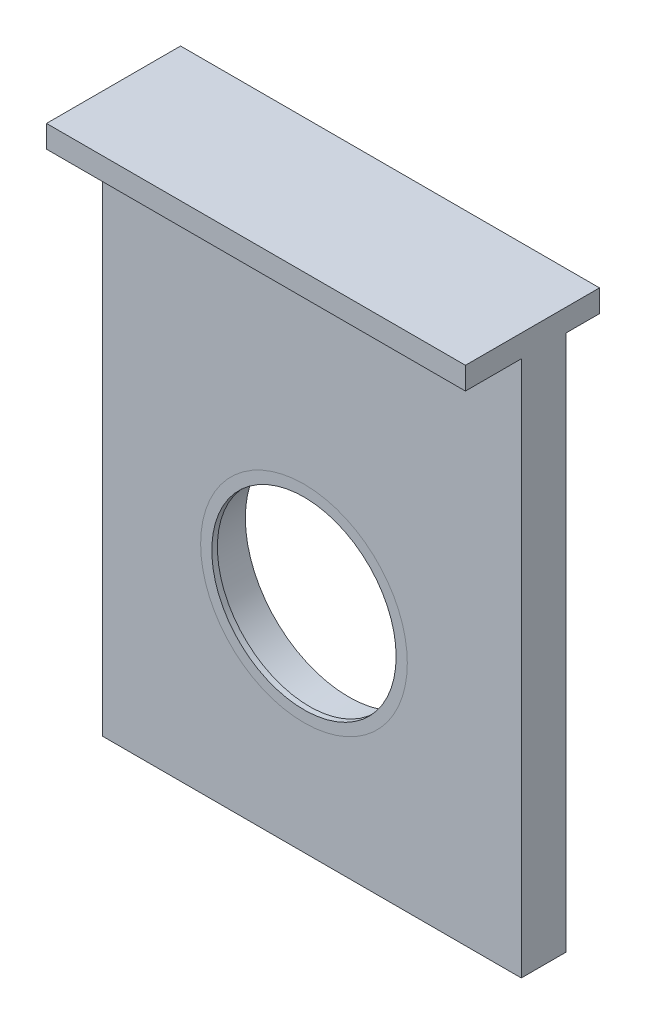
ISO-10303-21;
HEADER;
FILE_DESCRIPTION(('STEP AP214'),'2;1');
FILE_NAME('part.step','',(''),(''),'','','');
FILE_SCHEMA(('AUTOMOTIVE_DESIGN { 1 0 10303 214 1 1 1 1 }'));
ENDSEC;
DATA;
#1=APPLICATION_CONTEXT('core data for automotive mechanical design processes');
#2=APPLICATION_PROTOCOL_DEFINITION('international standard','automotive_design',2000,#1);
#3=PRODUCT_CONTEXT('',#1,'mechanical');
#4=PRODUCT('Part','Part','',(#3));
#5=PRODUCT_RELATED_PRODUCT_CATEGORY('part','',(#4));
#6=PRODUCT_DEFINITION_FORMATION('','',#4);
#7=PRODUCT_DEFINITION_CONTEXT('part definition',#1,'design');
#8=PRODUCT_DEFINITION('design','',#6,#7);
#9=PRODUCT_DEFINITION_SHAPE('','',#8);
#10=(LENGTH_UNIT() NAMED_UNIT(*) SI_UNIT(.MILLI.,.METRE.));
#11=(NAMED_UNIT(*) PLANE_ANGLE_UNIT() SI_UNIT($,.RADIAN.));
#12=(NAMED_UNIT(*) SI_UNIT($,.STERADIAN.) SOLID_ANGLE_UNIT());
#13=UNCERTAINTY_MEASURE_WITH_UNIT(LENGTH_MEASURE(1.E-05),#10,'distance_accuracy_value','');
#14=(GEOMETRIC_REPRESENTATION_CONTEXT(3) GLOBAL_UNCERTAINTY_ASSIGNED_CONTEXT((#13)) GLOBAL_UNIT_ASSIGNED_CONTEXT((#10,
#11,#12)) REPRESENTATION_CONTEXT('',''));
#15=CARTESIAN_POINT('',(0.,0.,0.));
#16=DIRECTION('',(0.,0.,1.));
#17=DIRECTION('',(1.,0.,0.));
#18=AXIS2_PLACEMENT_3D('',#15,#16,#17);
#19=CARTESIAN_POINT('',(98.2196206034018,38.6276036338557,7.));
#20=DIRECTION('',(0.,0.,1.));
#21=DIRECTION('',(1.,0.,0.));
#22=AXIS2_PLACEMENT_3D('',#19,#20,#21);
#23=CYLINDRICAL_SURFACE('',#22,18.5);
#24=CARTESIAN_POINT('',(98.2196206034018,38.6276036338557,7.));
#25=DIRECTION('',(0.,0.,1.));
#26=DIRECTION('',(1.,0.,0.));
#27=AXIS2_PLACEMENT_3D('',#24,#25,#26);
#28=CIRCLE('',#27,18.5);
#29=CARTESIAN_POINT('',(116.719620603402,38.6276036338557,7.));
#30=VERTEX_POINT('',#29);
#31=EDGE_CURVE('P0_E10',#30,#30,#28,.T.);
#32=ORIENTED_EDGE('',*,*,#31,.T.);
#33=EDGE_LOOP('',(#32));
#34=FACE_BOUND('',#33,.T.);
#35=CARTESIAN_POINT('',(98.2196206034018,38.6276036338557,8.));
#36=DIRECTION('',(0.,0.,1.));
#37=DIRECTION('',(1.,0.,0.));
#38=AXIS2_PLACEMENT_3D('',#35,#36,#37);
#39=CIRCLE('',#38,18.5);
#40=CARTESIAN_POINT('',(116.719620603402,38.6276036338557,8.));
#41=VERTEX_POINT('',#40);
#42=EDGE_CURVE('P0_E18',#41,#41,#39,.T.);
#43=ORIENTED_EDGE('',*,*,#42,.F.);
#44=EDGE_LOOP('',(#43));
#45=FACE_BOUND('',#44,.T.);
#46=ADVANCED_FACE('P0_F15',(#34,#45),#23,.T.);
#47=CARTESIAN_POINT('',(98.2196206034018,38.6276036338557,7.));
#48=DIRECTION('',(0.,0.,1.));
#49=DIRECTION('',(1.,0.,0.));
#50=AXIS2_PLACEMENT_3D('',#47,#48,#49);
#51=PLANE('',#50);
#52=CARTESIAN_POINT('',(98.2196206034018,38.6276036338557,7.));
#53=DIRECTION('',(0.,0.,1.));
#54=DIRECTION('',(1.,0.,0.));
#55=AXIS2_PLACEMENT_3D('',#52,#53,#54);
#56=CIRCLE('',#55,16.5);
#57=CARTESIAN_POINT('',(114.719620603402,38.6276036338557,7.));
#58=VERTEX_POINT('',#57);
#59=EDGE_CURVE('P0_E25',#58,#58,#56,.T.);
#60=ORIENTED_EDGE('',*,*,#59,.T.);
#61=EDGE_LOOP('',(#60));
#62=FACE_BOUND('',#61,.T.);
#63=ORIENTED_EDGE('',*,*,#31,.F.);
#64=EDGE_LOOP('',(#63));
#65=FACE_BOUND('',#64,.T.);
#66=ADVANCED_FACE('P0_F33',(#62,#65),#51,.F.);
#67=CARTESIAN_POINT('',(98.2196206034018,38.6276036338557,8.));
#68=DIRECTION('',(0.,0.,1.));
#69=DIRECTION('',(1.,0.,0.));
#70=AXIS2_PLACEMENT_3D('',#67,#68,#69);
#71=PLANE('',#70);
#72=CARTESIAN_POINT('',(98.2196206034018,38.6276036338557,8.));
#73=DIRECTION('',(0.,0.,1.));
#74=DIRECTION('',(1.,0.,0.));
#75=AXIS2_PLACEMENT_3D('',#72,#73,#74);
#76=CIRCLE('',#75,16.5);
#77=CARTESIAN_POINT('',(114.719620603402,38.6276036338557,8.));
#78=VERTEX_POINT('',#77);
#79=EDGE_CURVE('P0_E27',#78,#78,#76,.T.);
#80=ORIENTED_EDGE('',*,*,#79,.F.);
#81=EDGE_LOOP('',(#80));
#82=FACE_BOUND('',#81,.T.);
#83=ORIENTED_EDGE('',*,*,#42,.T.);
#84=EDGE_LOOP('',(#83));
#85=FACE_BOUND('',#84,.T.);
#86=ADVANCED_FACE('P0_F39',(#82,#85),#71,.T.);
#87=CARTESIAN_POINT('',(98.2196206034018,38.6276036338557,7.));
#88=DIRECTION('',(0.,0.,1.));
#89=DIRECTION('',(1.,0.,0.));
#90=AXIS2_PLACEMENT_3D('',#87,#88,#89);
#91=CYLINDRICAL_SURFACE('',#90,16.5);
#92=ORIENTED_EDGE('',*,*,#59,.F.);
#93=EDGE_LOOP('',(#92));
#94=FACE_BOUND('',#93,.T.);
#95=ORIENTED_EDGE('',*,*,#79,.T.);
#96=EDGE_LOOP('',(#95));
#97=FACE_BOUND('',#96,.T.);
#98=ADVANCED_FACE('P0_F36',(#94,#97),#91,.F.);
#99=CLOSED_SHELL('',(#46,#66,#86,#98));
#100=MANIFOLD_SOLID_BREP('P0_B1',#99);
#101=CARTESIAN_POINT('',(62.1258493643405,0.,8.));
#102=DIRECTION('',(-1.,0.,0.));
#103=DIRECTION('',(0.,-1.,0.));
#104=AXIS2_PLACEMENT_3D('',#101,#102,#103);
#105=PLANE('',#104);
#106=DIRECTION('',(0.,1.,0.));
#107=VECTOR('',#106,1.);
#108=CARTESIAN_POINT('',(62.1258493643405,0.,8.));
#109=LINE('',#108,#107);
#110=CARTESIAN_POINT('',(62.1258493643405,0.,8.));
#111=VERTEX_POINT('',#110);
#112=CARTESIAN_POINT('',(62.1258493643405,96.,8.));
#113=VERTEX_POINT('',#112);
#114=EDGE_CURVE('P1_E130',#111,#113,#109,.T.);
#115=ORIENTED_EDGE('',*,*,#114,.T.);
#116=DIRECTION('',(0.,0.,1.));
#117=VECTOR('',#116,1.);
#118=CARTESIAN_POINT('',(62.1258493643405,96.,-6.));
#119=LINE('',#118,#117);
#120=CARTESIAN_POINT('',(62.1258493643405,96.,18.));
#121=VERTEX_POINT('',#120);
#122=EDGE_CURVE('P1_E94',#113,#121,#119,.T.);
#123=ORIENTED_EDGE('',*,*,#122,.T.);
#124=DIRECTION('',(0.,-1.,0.));
#125=VECTOR('',#124,1.);
#126=CARTESIAN_POINT('',(62.1258493643405,100.,18.));
#127=LINE('',#126,#125);
#128=CARTESIAN_POINT('',(62.1258493643405,100.,18.));
#129=VERTEX_POINT('',#128);
#130=EDGE_CURVE('P1_E92',#129,#121,#127,.T.);
#131=ORIENTED_EDGE('',*,*,#130,.F.);
#132=DIRECTION('',(0.,0.,-1.));
#133=VECTOR('',#132,1.);
#134=CARTESIAN_POINT('',(62.1258493643405,100.,8.));
#135=LINE('',#134,#133);
#136=CARTESIAN_POINT('',(62.1258493643405,100.,-6.));
#137=VERTEX_POINT('',#136);
#138=EDGE_CURVE('P1_E78',#129,#137,#135,.T.);
#139=ORIENTED_EDGE('',*,*,#138,.T.);
#140=DIRECTION('',(0.,-1.,0.));
#141=VECTOR('',#140,1.);
#142=CARTESIAN_POINT('',(62.1258493643405,100.,-6.));
#143=LINE('',#142,#141);
#144=CARTESIAN_POINT('',(62.1258493643405,96.,-6.));
#145=VERTEX_POINT('',#144);
#146=EDGE_CURVE('P1_E112',#137,#145,#143,.T.);
#147=ORIENTED_EDGE('',*,*,#146,.T.);
#148=CARTESIAN_POINT('',(62.1258493643405,96.,0.));
#149=VERTEX_POINT('',#148);
#150=EDGE_CURVE('P1_E125',#145,#149,#119,.T.);
#151=ORIENTED_EDGE('',*,*,#150,.T.);
#152=DIRECTION('',(0.,1.,0.));
#153=VECTOR('',#152,1.);
#154=CARTESIAN_POINT('',(62.1258493643405,0.,0.));
#155=LINE('',#154,#153);
#156=CARTESIAN_POINT('',(62.1258493643405,0.,0.));
#157=VERTEX_POINT('',#156);
#158=EDGE_CURVE('P1_E34',#157,#149,#155,.T.);
#159=ORIENTED_EDGE('',*,*,#158,.F.);
#160=DIRECTION('',(0.,0.,-1.));
#161=VECTOR('',#160,1.);
#162=CARTESIAN_POINT('',(62.1258493643405,0.,8.));
#163=LINE('',#162,#161);
#164=EDGE_CURVE('P1_E24',#111,#157,#163,.T.);
#165=ORIENTED_EDGE('',*,*,#164,.F.);
#166=EDGE_LOOP('',(#115,#123,#131,#139,#147,#151,#159,#165));
#167=FACE_BOUND('',#166,.T.);
#168=ADVANCED_FACE('P1_F16',(#167),#105,.T.);
#169=CARTESIAN_POINT('',(62.1258493643405,0.,8.));
#170=DIRECTION('',(0.,1.,0.));
#171=DIRECTION('',(-1.,0.,0.));
#172=AXIS2_PLACEMENT_3D('',#169,#170,#171);
#173=PLANE('',#172);
#174=DIRECTION('',(1.,0.,0.));
#175=VECTOR('',#174,1.);
#176=CARTESIAN_POINT('',(62.1258493643405,0.,0.));
#177=LINE('',#176,#175);
#178=CARTESIAN_POINT('',(137.12584936434,0.,0.));
#179=VERTEX_POINT('',#178);
#180=EDGE_CURVE('P1_E133',#157,#179,#177,.T.);
#181=ORIENTED_EDGE('',*,*,#180,.T.);
#182=DIRECTION('',(0.,0.,-1.));
#183=VECTOR('',#182,1.);
#184=CARTESIAN_POINT('',(137.12584936434,0.,8.));
#185=LINE('',#184,#183);
#186=CARTESIAN_POINT('',(137.12584936434,0.,8.));
#187=VERTEX_POINT('',#186);
#188=EDGE_CURVE('P1_E143',#187,#179,#185,.T.);
#189=ORIENTED_EDGE('',*,*,#188,.F.);
#190=DIRECTION('',(1.,0.,0.));
#191=VECTOR('',#190,1.);
#192=CARTESIAN_POINT('',(62.1258493643405,0.,8.));
#193=LINE('',#192,#191);
#194=EDGE_CURVE('P1_E89',#111,#187,#193,.T.);
#195=ORIENTED_EDGE('',*,*,#194,.F.);
#196=ORIENTED_EDGE('',*,*,#164,.T.);
#197=EDGE_LOOP('',(#181,#189,#195,#196));
#198=FACE_BOUND('',#197,.T.);
#199=ADVANCED_FACE('P1_F158',(#198),#173,.F.);
#200=CARTESIAN_POINT('',(137.12584936434,100.,8.));
#201=DIRECTION('',(1.,0.,0.));
#202=DIRECTION('',(0.,0.,-1.));
#203=AXIS2_PLACEMENT_3D('',#200,#201,#202);
#204=PLANE('',#203);
#205=DIRECTION('',(0.,-1.,0.));
#206=VECTOR('',#205,1.);
#207=CARTESIAN_POINT('',(137.12584936434,100.,0.));
#208=LINE('',#207,#206);
#209=CARTESIAN_POINT('',(137.12584936434,96.,0.));
#210=VERTEX_POINT('',#209);
#211=EDGE_CURVE('P1_E138',#210,#179,#208,.T.);
#212=ORIENTED_EDGE('',*,*,#211,.F.);
#213=DIRECTION('',(0.,0.,1.));
#214=VECTOR('',#213,1.);
#215=CARTESIAN_POINT('',(137.12584936434,96.,-6.));
#216=LINE('',#215,#214);
#217=CARTESIAN_POINT('',(137.12584936434,96.,-6.));
#218=VERTEX_POINT('',#217);
#219=EDGE_CURVE('P1_E120',#218,#210,#216,.T.);
#220=ORIENTED_EDGE('',*,*,#219,.F.);
#221=DIRECTION('',(0.,1.,0.));
#222=VECTOR('',#221,1.);
#223=CARTESIAN_POINT('',(137.12584936434,96.,-6.));
#224=LINE('',#223,#222);
#225=CARTESIAN_POINT('',(137.12584936434,100.,-6.));
#226=VERTEX_POINT('',#225);
#227=EDGE_CURVE('P1_E117',#218,#226,#224,.T.);
#228=ORIENTED_EDGE('',*,*,#227,.T.);
#229=DIRECTION('',(0.,0.,-1.));
#230=VECTOR('',#229,1.);
#231=CARTESIAN_POINT('',(137.12584936434,100.,8.));
#232=LINE('',#231,#230);
#233=CARTESIAN_POINT('',(137.12584936434,100.,18.));
#234=VERTEX_POINT('',#233);
#235=EDGE_CURVE('P1_E88',#234,#226,#232,.T.);
#236=ORIENTED_EDGE('',*,*,#235,.F.);
#237=DIRECTION('',(0.,1.,0.));
#238=VECTOR('',#237,1.);
#239=CARTESIAN_POINT('',(137.12584936434,96.,18.));
#240=LINE('',#239,#238);
#241=CARTESIAN_POINT('',(137.12584936434,96.,18.));
#242=VERTEX_POINT('',#241);
#243=EDGE_CURVE('P1_E103',#242,#234,#240,.T.);
#244=ORIENTED_EDGE('',*,*,#243,.F.);
#245=CARTESIAN_POINT('',(137.12584936434,96.,8.));
#246=VERTEX_POINT('',#245);
#247=EDGE_CURVE('P1_E124',#246,#242,#216,.T.);
#248=ORIENTED_EDGE('',*,*,#247,.F.);
#249=DIRECTION('',(0.,-1.,0.));
#250=VECTOR('',#249,1.);
#251=CARTESIAN_POINT('',(137.12584936434,100.,8.));
#252=LINE('',#251,#250);
#253=EDGE_CURVE('P1_E132',#246,#187,#252,.T.);
#254=ORIENTED_EDGE('',*,*,#253,.T.);
#255=ORIENTED_EDGE('',*,*,#188,.T.);
#256=EDGE_LOOP('',(#212,#220,#228,#236,#244,#248,#254,#255));
#257=FACE_BOUND('',#256,.T.);
#258=ADVANCED_FACE('P1_F151',(#257),#204,.T.);
#259=CARTESIAN_POINT('',(62.1258493643405,100.,8.));
#260=DIRECTION('',(0.,1.,0.));
#261=DIRECTION('',(0.,0.,1.));
#262=AXIS2_PLACEMENT_3D('',#259,#260,#261);
#263=PLANE('',#262);
#264=ORIENTED_EDGE('',*,*,#235,.T.);
#265=DIRECTION('',(-1.,0.,0.));
#266=VECTOR('',#265,1.);
#267=CARTESIAN_POINT('',(137.12584936434,100.,-6.));
#268=LINE('',#267,#266);
#269=EDGE_CURVE('P1_E84',#226,#137,#268,.T.);
#270=ORIENTED_EDGE('',*,*,#269,.T.);
#271=ORIENTED_EDGE('',*,*,#138,.F.);
#272=DIRECTION('',(-1.,0.,0.));
#273=VECTOR('',#272,1.);
#274=CARTESIAN_POINT('',(137.12584936434,100.,18.));
#275=LINE('',#274,#273);
#276=EDGE_CURVE('P1_E82',#234,#129,#275,.T.);
#277=ORIENTED_EDGE('',*,*,#276,.F.);
#278=EDGE_LOOP('',(#264,#270,#271,#277));
#279=FACE_BOUND('',#278,.T.);
#280=ADVANCED_FACE('P1_F80',(#279),#263,.T.);
#281=CARTESIAN_POINT('',(0.,0.,8.));
#282=DIRECTION('',(0.,0.,-1.));
#283=DIRECTION('',(-1.,0.,0.));
#284=AXIS2_PLACEMENT_3D('',#281,#282,#283);
#285=PLANE('',#284);
#286=CARTESIAN_POINT('',(98.2196206034018,38.6276036338557,8.));
#287=DIRECTION('',(0.,0.,1.));
#288=DIRECTION('',(1.,0.,0.));
#289=AXIS2_PLACEMENT_3D('',#286,#287,#288);
#290=CIRCLE('',#289,18.5);
#291=CARTESIAN_POINT('',(116.719620603402,38.6276036338557,8.));
#292=VERTEX_POINT('',#291);
#293=EDGE_CURVE('P1_E106',#292,#292,#290,.T.);
#294=ORIENTED_EDGE('',*,*,#293,.F.);
#295=EDGE_LOOP('',(#294));
#296=FACE_BOUND('',#295,.T.);
#297=ORIENTED_EDGE('',*,*,#253,.F.);
#298=DIRECTION('',(-1.,0.,0.));
#299=VECTOR('',#298,1.);
#300=CARTESIAN_POINT('',(0.,96.,8.));
#301=LINE('',#300,#299);
#302=EDGE_CURVE('P1_E123',#246,#113,#301,.T.);
#303=ORIENTED_EDGE('',*,*,#302,.T.);
#304=ORIENTED_EDGE('',*,*,#114,.F.);
#305=ORIENTED_EDGE('',*,*,#194,.T.);
#306=EDGE_LOOP('',(#297,#303,#304,#305));
#307=FACE_BOUND('',#306,.T.);
#308=ADVANCED_FACE('P1_F161',(#296,#307),#285,.F.);
#309=CARTESIAN_POINT('',(0.,0.,0.));
#310=DIRECTION('',(0.,0.,-1.));
#311=DIRECTION('',(-1.,0.,0.));
#312=AXIS2_PLACEMENT_3D('',#309,#310,#311);
#313=PLANE('',#312);
#314=CARTESIAN_POINT('',(98.2196206034018,38.6276036338557,0.));
#315=DIRECTION('',(0.,0.,-1.));
#316=DIRECTION('',(-1.,0.,0.));
#317=AXIS2_PLACEMENT_3D('',#314,#315,#316);
#318=CIRCLE('',#317,18.5);
#319=CARTESIAN_POINT('',(79.7196206034018,38.6276036338557,0.));
#320=VERTEX_POINT('',#319);
#321=EDGE_CURVE('P1_E19',#320,#320,#318,.T.);
#322=ORIENTED_EDGE('',*,*,#321,.F.);
#323=EDGE_LOOP('',(#322));
#324=FACE_BOUND('',#323,.T.);
#325=DIRECTION('',(-1.,0.,0.));
#326=VECTOR('',#325,1.);
#327=CARTESIAN_POINT('',(0.,96.,0.));
#328=LINE('',#327,#326);
#329=EDGE_CURVE('P1_E10',#210,#149,#328,.T.);
#330=ORIENTED_EDGE('',*,*,#329,.F.);
#331=ORIENTED_EDGE('',*,*,#211,.T.);
#332=ORIENTED_EDGE('',*,*,#180,.F.);
#333=ORIENTED_EDGE('',*,*,#158,.T.);
#334=EDGE_LOOP('',(#330,#331,#332,#333));
#335=FACE_BOUND('',#334,.T.);
#336=ADVANCED_FACE('P1_F165',(#324,#335),#313,.T.);
#337=CARTESIAN_POINT('',(0.,0.,-6.));
#338=DIRECTION('',(0.,0.,1.));
#339=DIRECTION('',(1.,0.,0.));
#340=AXIS2_PLACEMENT_3D('',#337,#338,#339);
#341=PLANE('',#340);
#342=ORIENTED_EDGE('',*,*,#269,.F.);
#343=ORIENTED_EDGE('',*,*,#227,.F.);
#344=DIRECTION('',(1.,0.,0.));
#345=VECTOR('',#344,1.);
#346=CARTESIAN_POINT('',(62.1258493643405,96.,-6.));
#347=LINE('',#346,#345);
#348=EDGE_CURVE('P1_E114',#145,#218,#347,.T.);
#349=ORIENTED_EDGE('',*,*,#348,.F.);
#350=ORIENTED_EDGE('',*,*,#146,.F.);
#351=EDGE_LOOP('',(#342,#343,#349,#350));
#352=FACE_BOUND('',#351,.T.);
#353=ADVANCED_FACE('P1_F149',(#352),#341,.F.);
#354=CARTESIAN_POINT('',(62.1258493643405,96.,-6.));
#355=DIRECTION('',(0.,-1.,0.));
#356=DIRECTION('',(0.,0.,-1.));
#357=AXIS2_PLACEMENT_3D('',#354,#355,#356);
#358=PLANE('',#357);
#359=ORIENTED_EDGE('',*,*,#219,.T.);
#360=ORIENTED_EDGE('',*,*,#329,.T.);
#361=ORIENTED_EDGE('',*,*,#150,.F.);
#362=ORIENTED_EDGE('',*,*,#348,.T.);
#363=EDGE_LOOP('',(#359,#360,#361,#362));
#364=FACE_BOUND('',#363,.T.);
#365=ADVANCED_FACE('P1_F153',(#364),#358,.T.);
#366=ORIENTED_EDGE('',*,*,#302,.F.);
#367=ORIENTED_EDGE('',*,*,#247,.T.);
#368=DIRECTION('',(1.,0.,0.));
#369=VECTOR('',#368,1.);
#370=CARTESIAN_POINT('',(62.1258493643405,96.,18.));
#371=LINE('',#370,#369);
#372=EDGE_CURVE('P1_E98',#121,#242,#371,.T.);
#373=ORIENTED_EDGE('',*,*,#372,.F.);
#374=ORIENTED_EDGE('',*,*,#122,.F.);
#375=EDGE_LOOP('',(#366,#367,#373,#374));
#376=FACE_BOUND('',#375,.T.);
#377=ADVANCED_FACE('P1_F164',(#376),#358,.T.);
#378=CARTESIAN_POINT('',(0.,0.,18.));
#379=DIRECTION('',(0.,0.,1.));
#380=DIRECTION('',(1.,0.,0.));
#381=AXIS2_PLACEMENT_3D('',#378,#379,#380);
#382=PLANE('',#381);
#383=ORIENTED_EDGE('',*,*,#276,.T.);
#384=ORIENTED_EDGE('',*,*,#130,.T.);
#385=ORIENTED_EDGE('',*,*,#372,.T.);
#386=ORIENTED_EDGE('',*,*,#243,.T.);
#387=EDGE_LOOP('',(#383,#384,#385,#386));
#388=FACE_BOUND('',#387,.T.);
#389=ADVANCED_FACE('P1_F101',(#388),#382,.T.);
#390=CARTESIAN_POINT('',(98.2196206034018,38.6276036338557,-6.));
#391=DIRECTION('',(0.,0.,1.));
#392=DIRECTION('',(1.,0.,0.));
#393=AXIS2_PLACEMENT_3D('',#390,#391,#392);
#394=CYLINDRICAL_SURFACE('',#393,18.5);
#395=ORIENTED_EDGE('',*,*,#321,.T.);
#396=EDGE_LOOP('',(#395));
#397=FACE_BOUND('',#396,.T.);
#398=ORIENTED_EDGE('',*,*,#293,.T.);
#399=EDGE_LOOP('',(#398));
#400=FACE_BOUND('',#399,.T.);
#401=ADVANCED_FACE('P1_F250',(#397,#400),#394,.F.);
#402=CLOSED_SHELL('',(#168,#199,#258,#280,#308,#336,#353,#365,#377,#389,#401));
#403=MANIFOLD_SOLID_BREP('P1_B1',#402);
#404=ADVANCED_BREP_SHAPE_REPRESENTATION('',(#18,#100,#403),#14);
#405=SHAPE_DEFINITION_REPRESENTATION(#9,#404);
ENDSEC;
END-ISO-10303-21;
